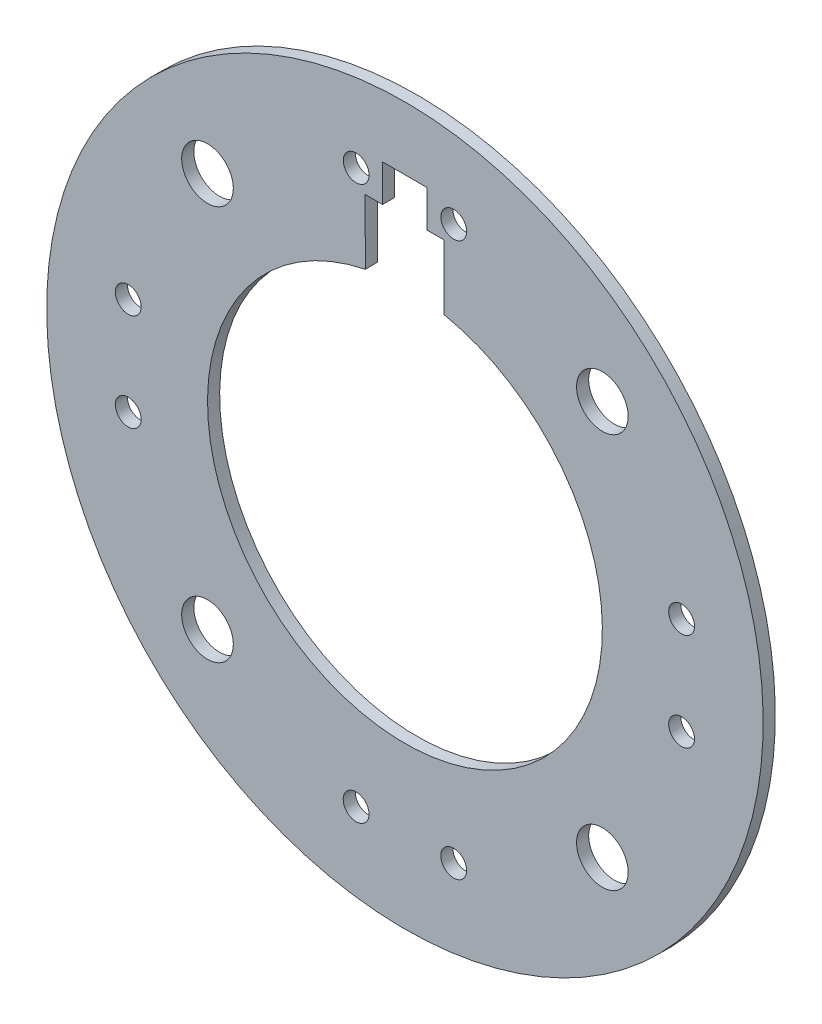
ISO-10303-21;
HEADER;
FILE_DESCRIPTION(('STEP AP214'),'2;1');
FILE_NAME('part.step','',(''),(''),'','','');
FILE_SCHEMA(('AUTOMOTIVE_DESIGN { 1 0 10303 214 1 1 1 1 }'));
ENDSEC;
DATA;
#1=APPLICATION_CONTEXT('core data for automotive mechanical design processes');
#2=APPLICATION_PROTOCOL_DEFINITION('international standard','automotive_design',2000,#1);
#3=PRODUCT_CONTEXT('',#1,'mechanical');
#4=PRODUCT('Part','Part','',(#3));
#5=PRODUCT_RELATED_PRODUCT_CATEGORY('part','',(#4));
#6=PRODUCT_DEFINITION_FORMATION('','',#4);
#7=PRODUCT_DEFINITION_CONTEXT('part definition',#1,'design');
#8=PRODUCT_DEFINITION('design','',#6,#7);
#9=PRODUCT_DEFINITION_SHAPE('','',#8);
#10=(LENGTH_UNIT() NAMED_UNIT(*) SI_UNIT(.MILLI.,.METRE.));
#11=(NAMED_UNIT(*) PLANE_ANGLE_UNIT() SI_UNIT($,.RADIAN.));
#12=(NAMED_UNIT(*) SI_UNIT($,.STERADIAN.) SOLID_ANGLE_UNIT());
#13=UNCERTAINTY_MEASURE_WITH_UNIT(LENGTH_MEASURE(1.E-05),#10,'distance_accuracy_value','');
#14=(GEOMETRIC_REPRESENTATION_CONTEXT(3) GLOBAL_UNCERTAINTY_ASSIGNED_CONTEXT((#13)) GLOBAL_UNIT_ASSIGNED_CONTEXT((#10,
#11,#12)) REPRESENTATION_CONTEXT('',''));
#15=CARTESIAN_POINT('',(0.,0.,0.));
#16=DIRECTION('',(0.,0.,1.));
#17=DIRECTION('',(1.,0.,0.));
#18=AXIS2_PLACEMENT_3D('',#15,#16,#17);
#19=CARTESIAN_POINT('',(-7.37144135781887,84.9999269356003,497.500013408569));
#20=DIRECTION('',(-1.,7.77181219380196E-09,0.));
#21=DIRECTION('',(0.,0.,1.));
#22=AXIS2_PLACEMENT_3D('',#19,#20,#21);
#23=PLANE('',#22);
#24=DIRECTION('',(7.77181219380196E-09,1.,0.));
#25=VECTOR('',#24,1.);
#26=CARTESIAN_POINT('',(-7.3714416881206,42.4999634964449,513.500013408569));
#27=LINE('',#26,#25);
#28=CARTESIAN_POINT('',(-7.3714413578679,84.9936173798591,513.500013408569));
#29=VERTEX_POINT('',#28);
#30=CARTESIAN_POINT('',(-7.37144126336427,97.1534100968481,513.500013408569));
#31=VERTEX_POINT('',#30);
#32=EDGE_CURVE('E639',#29,#31,#27,.T.);
#33=ORIENTED_EDGE('',*,*,#32,.T.);
#34=DIRECTION('',(0.,0.,-1.));
#35=VECTOR('',#34,1.);
#36=CARTESIAN_POINT('',(-7.37144126336427,97.1534100968481,501.500013408569));
#37=LINE('',#36,#35);
#38=CARTESIAN_POINT('',(-7.37144126336427,97.1534100968481,517.500013408569));
#39=VERTEX_POINT('',#38);
#40=EDGE_CURVE('E295',#39,#31,#37,.T.);
#41=ORIENTED_EDGE('',*,*,#40,.F.);
#42=DIRECTION('',(7.77181219380196E-09,1.,0.));
#43=VECTOR('',#42,1.);
#44=CARTESIAN_POINT('',(-7.37144129117325,93.575225187815,517.500013408569));
#45=LINE('',#44,#43);
#46=CARTESIAN_POINT('',(-7.37144135786791,84.9936173798591,517.500013408569));
#47=VERTEX_POINT('',#46);
#48=EDGE_CURVE('E347',#47,#39,#45,.T.);
#49=ORIENTED_EDGE('',*,*,#48,.F.);
#50=DIRECTION('',(0.,0.,-1.));
#51=VECTOR('',#50,1.);
#52=CARTESIAN_POINT('',(-7.3714413578679,84.9936173798591,485.500013170151));
#53=LINE('',#52,#51);
#54=EDGE_CURVE('E11',#47,#29,#53,.T.);
#55=ORIENTED_EDGE('',*,*,#54,.T.);
#56=EDGE_LOOP('',(#33,#41,#49,#55));
#57=FACE_BOUND('',#56,.T.);
#58=ADVANCED_FACE('F17',(#57),#23,.F.);
#59=CARTESIAN_POINT('',(12.9265078392562,85.0111661188135,465.500012931734));
#60=DIRECTION('',(-0.000864556917818171,0.999999626270598,0.));
#61=DIRECTION('',(0.,0.,1.));
#62=AXIS2_PLACEMENT_3D('',#59,#60,#61);
#63=PLANE('',#62);
#64=DIRECTION('',(0.999999626270598,0.000864556917818171,0.));
#65=VECTOR('',#64,1.);
#66=CARTESIAN_POINT('',(6.4265102684973,85.0055464988477,513.500013408569));
#67=LINE('',#66,#65);
#68=CARTESIAN_POINT('',(-13.0734824437794,84.9886876389502,513.500013408569));
#69=VERTEX_POINT('',#68);
#70=EDGE_CURVE('E236',#69,#29,#67,.T.);
#71=ORIENTED_EDGE('',*,*,#70,.T.);
#72=ORIENTED_EDGE('',*,*,#54,.F.);
#73=DIRECTION('',(0.999999626270598,0.000864556917818171,0.));
#74=VECTOR('',#73,1.);
#75=CARTESIAN_POINT('',(-23.0176264544443,84.980090357241,517.500013408569));
#76=LINE('',#75,#74);
#77=CARTESIAN_POINT('',(-13.0734824437794,84.9886876389502,517.500013408569));
#78=VERTEX_POINT('',#77);
#79=EDGE_CURVE('E232',#78,#47,#76,.T.);
#80=ORIENTED_EDGE('',*,*,#79,.F.);
#81=DIRECTION('',(0.,0.,1.));
#82=VECTOR('',#81,1.);
#83=CARTESIAN_POINT('',(-13.0734824437794,84.9886876389502,465.500012931734));
#84=LINE('',#83,#82);
#85=EDGE_CURVE('E20',#69,#78,#84,.T.);
#86=ORIENTED_EDGE('',*,*,#85,.F.);
#87=EDGE_LOOP('',(#71,#72,#80,#86));
#88=FACE_BOUND('',#87,.T.);
#89=ADVANCED_FACE('F590',(#88),#63,.F.);
#90=CARTESIAN_POINT('',(-13.0734824437794,84.9886876389502,465.500012931734));
#91=DIRECTION('',(-0.999999626270598,-0.000864556917818837,0.));
#92=DIRECTION('',(-0.000864556917818837,0.999999626270598,0.));
#93=AXIS2_PLACEMENT_3D('',#90,#91,#92);
#94=PLANE('',#93);
#95=DIRECTION('',(-0.000864556917818837,0.999999626270598,0.));
#96=VECTOR('',#95,1.);
#97=CARTESIAN_POINT('',(-13.0367387926486,42.4887241995093,513.500013408569));
#98=LINE('',#97,#96);
#99=CARTESIAN_POINT('',(-13.0550559473763,63.6754702708262,513.500013408569));
#100=VERTEX_POINT('',#99);
#101=EDGE_CURVE('E254',#100,#69,#98,.T.);
#102=ORIENTED_EDGE('',*,*,#101,.T.);
#103=ORIENTED_EDGE('',*,*,#85,.T.);
#104=DIRECTION('',(-0.000864556917818837,0.999999626270598,0.));
#105=VECTOR('',#104,1.);
#106=CARTESIAN_POINT('',(-13.0809182884659,93.5894422616638,517.500013408569));
#107=LINE('',#106,#105);
#108=CARTESIAN_POINT('',(-13.0550559473763,63.6754702708262,517.500013408569));
#109=VERTEX_POINT('',#108);
#110=EDGE_CURVE('E346',#109,#78,#107,.T.);
#111=ORIENTED_EDGE('',*,*,#110,.F.);
#112=DIRECTION('',(0.,0.,1.));
#113=VECTOR('',#112,1.);
#114=CARTESIAN_POINT('',(-13.0550559473763,63.6754702708262,493.00001328936));
#115=LINE('',#114,#113);
#116=EDGE_CURVE('E47',#100,#109,#115,.T.);
#117=ORIENTED_EDGE('',*,*,#116,.F.);
#118=EDGE_LOOP('',(#102,#103,#111,#117));
#119=FACE_BOUND('',#118,.T.);
#120=ADVANCED_FACE('F582',(#119),#94,.F.);
#121=CARTESIAN_POINT('',(0.,0.,489.00001328936));
#122=DIRECTION('',(0.,0.,-1.));
#123=DIRECTION('',(0.000864556917818641,-0.999999626270598,0.));
#124=AXIS2_PLACEMENT_3D('',#121,#122,#123);
#125=CYLINDRICAL_SURFACE('',#124,65.);
#126=CARTESIAN_POINT('',(0.,0.,513.500013408569));
#127=DIRECTION('',(0.,0.,-1.));
#128=DIRECTION('',(-0.5,0.866025403784439,0.));
#129=AXIS2_PLACEMENT_3D('',#126,#127,#128);
#130=CIRCLE('',#129,65.);
#131=CARTESIAN_POINT('',(12.9449343356593,63.6979487506895,513.500013408569));
#132=VERTEX_POINT('',#131);
#133=EDGE_CURVE('E703',#132,#100,#130,.T.);
#134=ORIENTED_EDGE('',*,*,#133,.T.);
#135=ORIENTED_EDGE('',*,*,#116,.T.);
#136=CARTESIAN_POINT('',(0.,0.,517.500013408569));
#137=DIRECTION('',(0.,0.,-1.));
#138=DIRECTION('',(0.5,-0.866025403784439,0.));
#139=AXIS2_PLACEMENT_3D('',#136,#137,#138);
#140=CIRCLE('',#139,65.);
#141=CARTESIAN_POINT('',(12.9449343356593,63.6979487506895,517.500013408569));
#142=VERTEX_POINT('',#141);
#143=EDGE_CURVE('E342',#142,#109,#140,.T.);
#144=ORIENTED_EDGE('',*,*,#143,.F.);
#145=DIRECTION('',(0.,0.,-1.));
#146=VECTOR('',#145,1.);
#147=CARTESIAN_POINT('',(12.9449343356593,63.6979487506895,493.00001328936));
#148=LINE('',#147,#146);
#149=EDGE_CURVE('E304',#142,#132,#148,.T.);
#150=ORIENTED_EDGE('',*,*,#149,.T.);
#151=EDGE_LOOP('',(#134,#135,#144,#150));
#152=FACE_BOUND('',#151,.T.);
#153=ADVANCED_FACE('F573',(#152),#125,.F.);
#154=CARTESIAN_POINT('',(-65.0006505257643,-65.0023113096677,467.499925954795));
#155=DIRECTION('',(-3.29805491736336E-11,0.,1.));
#156=DIRECTION('',(-1.,0.,-3.29805491736336E-11));
#157=AXIS2_PLACEMENT_3D('',#154,#155,#156);
#158=CYLINDRICAL_SURFACE('',#157,8.5);
#159=CARTESIAN_POINT('',(-65.0006505272814,-65.0023113096678,513.500013406425));
#160=DIRECTION('',(3.29805491736336E-11,0.,-1.));
#161=DIRECTION('',(-1.,0.,-3.29805491736336E-11));
#162=AXIS2_PLACEMENT_3D('',#159,#160,#161);
#163=CIRCLE('',#162,8.5);
#164=CARTESIAN_POINT('',(-56.5006505272814,-65.0023113096678,513.500013406706));
#165=VERTEX_POINT('',#164);
#166=EDGE_CURVE('E249',#165,#165,#163,.T.);
#167=ORIENTED_EDGE('',*,*,#166,.T.);
#168=DIRECTION('',(-3.29805491736336E-11,0.,1.));
#169=VECTOR('',#168,1.);
#170=CARTESIAN_POINT('',(-56.5006505257643,-65.0023113096677,467.499925955075));
#171=LINE('',#170,#169);
#172=CARTESIAN_POINT('',(-56.5006505274134,-65.0023113096678,517.50001340865));
#173=VERTEX_POINT('',#172);
#174=EDGE_CURVE('E380',#165,#173,#171,.T.);
#175=ORIENTED_EDGE('',*,*,#174,.T.);
#176=CARTESIAN_POINT('',(-65.0006505274134,-65.0023113096678,517.50001340837));
#177=DIRECTION('',(3.29805491736336E-11,0.,-1.));
#178=DIRECTION('',(-1.,0.,-3.29805491736336E-11));
#179=AXIS2_PLACEMENT_3D('',#176,#177,#178);
#180=CIRCLE('',#179,8.5);
#181=EDGE_CURVE('E275',#173,#173,#180,.T.);
#182=ORIENTED_EDGE('',*,*,#181,.F.);
#183=ORIENTED_EDGE('',*,*,#174,.F.);
#184=EDGE_LOOP('',(#167,#175,#182,#183));
#185=FACE_BOUND('',#184,.T.);
#186=ADVANCED_FACE('F564',(#185),#158,.F.);
#187=CARTESIAN_POINT('',(65.0006479123251,65.0025555502862,467.499925959083));
#188=DIRECTION('',(-3.29805565751205E-11,0.,1.));
#189=DIRECTION('',(-1.,0.,-3.29805565751205E-11));
#190=AXIS2_PLACEMENT_3D('',#187,#188,#189);
#191=CYLINDRICAL_SURFACE('',#190,8.5);
#192=CARTESIAN_POINT('',(65.0006479108079,65.002555550286,513.500013410713));
#193=DIRECTION('',(3.29805565751205E-11,0.,-1.));
#194=DIRECTION('',(-1.,0.,-3.29805565751205E-11));
#195=AXIS2_PLACEMENT_3D('',#192,#193,#194);
#196=CIRCLE('',#195,8.5);
#197=CARTESIAN_POINT('',(73.5006479108079,65.002555550286,513.500013410993));
#198=VERTEX_POINT('',#197);
#199=EDGE_CURVE('E253',#198,#198,#196,.T.);
#200=ORIENTED_EDGE('',*,*,#199,.T.);
#201=DIRECTION('',(-3.29805565751205E-11,0.,1.));
#202=VECTOR('',#201,1.);
#203=CARTESIAN_POINT('',(73.500647912325,65.0025555502862,467.499925959363));
#204=LINE('',#203,#202);
#205=CARTESIAN_POINT('',(73.500647910676,65.002555550286,517.500013412938));
#206=VERTEX_POINT('',#205);
#207=EDGE_CURVE('E379',#198,#206,#204,.T.);
#208=ORIENTED_EDGE('',*,*,#207,.T.);
#209=CARTESIAN_POINT('',(65.000647910676,65.002555550286,517.500013412658));
#210=DIRECTION('',(3.29805565751205E-11,0.,-1.));
#211=DIRECTION('',(-1.,0.,-3.29805565751205E-11));
#212=AXIS2_PLACEMENT_3D('',#209,#210,#211);
#213=CIRCLE('',#212,8.5);
#214=EDGE_CURVE('E271',#206,#206,#213,.T.);
#215=ORIENTED_EDGE('',*,*,#214,.F.);
#216=ORIENTED_EDGE('',*,*,#207,.F.);
#217=EDGE_LOOP('',(#200,#208,#215,#216));
#218=FACE_BOUND('',#217,.T.);
#219=ADVANCED_FACE('F429',(#218),#191,.F.);
#220=CARTESIAN_POINT('',(65.0024321232573,-65.0005270987355,467.499925959082));
#221=DIRECTION('',(-3.2980578779581E-11,0.,1.));
#222=DIRECTION('',(-1.,0.,-3.2980578779581E-11));
#223=AXIS2_PLACEMENT_3D('',#220,#221,#222);
#224=CYLINDRICAL_SURFACE('',#223,8.5);
#225=CARTESIAN_POINT('',(65.0024321217402,-65.0005270987356,513.500013410713));
#226=DIRECTION('',(3.2980578779581E-11,0.,-1.));
#227=DIRECTION('',(-1.,0.,-3.2980578779581E-11));
#228=AXIS2_PLACEMENT_3D('',#225,#226,#227);
#229=CIRCLE('',#228,8.5);
#230=CARTESIAN_POINT('',(73.5024321217402,-65.0005270987356,513.500013410993));
#231=VERTEX_POINT('',#230);
#232=EDGE_CURVE('E242',#231,#231,#229,.T.);
#233=ORIENTED_EDGE('',*,*,#232,.T.);
#234=DIRECTION('',(-3.2980578779581E-11,0.,1.));
#235=VECTOR('',#234,1.);
#236=CARTESIAN_POINT('',(73.5024321232573,-65.0005270987355,467.499925959363));
#237=LINE('',#236,#235);
#238=CARTESIAN_POINT('',(73.5024321216083,-65.0005270987356,517.500013412938));
#239=VERTEX_POINT('',#238);
#240=EDGE_CURVE('E371',#231,#239,#237,.T.);
#241=ORIENTED_EDGE('',*,*,#240,.T.);
#242=CARTESIAN_POINT('',(65.0024321216083,-65.0005270987356,517.500013412658));
#243=DIRECTION('',(3.2980578779581E-11,0.,-1.));
#244=DIRECTION('',(-1.,0.,-3.2980578779581E-11));
#245=AXIS2_PLACEMENT_3D('',#242,#243,#244);
#246=CIRCLE('',#245,8.5);
#247=EDGE_CURVE('E276',#239,#239,#246,.T.);
#248=ORIENTED_EDGE('',*,*,#247,.F.);
#249=ORIENTED_EDGE('',*,*,#240,.F.);
#250=EDGE_LOOP('',(#233,#241,#248,#249));
#251=FACE_BOUND('',#250,.T.);
#252=ADVANCED_FACE('F423',(#251),#224,.F.);
#253=CARTESIAN_POINT('',(-65.0024347366966,65.0007713393539,467.499925954795));
#254=DIRECTION('',(-3.2980578779581E-11,0.,1.));
#255=DIRECTION('',(-1.,0.,-3.2980578779581E-11));
#256=AXIS2_PLACEMENT_3D('',#253,#254,#255);
#257=CYLINDRICAL_SURFACE('',#256,8.5);
#258=CARTESIAN_POINT('',(-65.0024347382137,65.0007713393538,513.500013406426));
#259=DIRECTION('',(3.2980578779581E-11,0.,-1.));
#260=DIRECTION('',(-1.,0.,-3.2980578779581E-11));
#261=AXIS2_PLACEMENT_3D('',#258,#259,#260);
#262=CIRCLE('',#261,8.5);
#263=CARTESIAN_POINT('',(-56.5024347382137,65.0007713393538,513.500013406706));
#264=VERTEX_POINT('',#263);
#265=EDGE_CURVE('E238',#264,#264,#262,.T.);
#266=ORIENTED_EDGE('',*,*,#265,.T.);
#267=DIRECTION('',(-3.2980578779581E-11,0.,1.));
#268=VECTOR('',#267,1.);
#269=CARTESIAN_POINT('',(-56.5024347366966,65.0007713393539,467.499925955075));
#270=LINE('',#269,#268);
#271=CARTESIAN_POINT('',(-56.5024347383456,65.0007713393537,517.500013408651));
#272=VERTEX_POINT('',#271);
#273=EDGE_CURVE('E368',#264,#272,#270,.T.);
#274=ORIENTED_EDGE('',*,*,#273,.T.);
#275=CARTESIAN_POINT('',(-65.0024347383456,65.0007713393537,517.50001340837));
#276=DIRECTION('',(3.2980578779581E-11,0.,-1.));
#277=DIRECTION('',(-1.,0.,-3.2980578779581E-11));
#278=AXIS2_PLACEMENT_3D('',#275,#276,#277);
#279=CIRCLE('',#278,8.5);
#280=EDGE_CURVE('E338',#272,#272,#279,.T.);
#281=ORIENTED_EDGE('',*,*,#280,.F.);
#282=ORIENTED_EDGE('',*,*,#273,.F.);
#283=EDGE_LOOP('',(#266,#274,#281,#282));
#284=FACE_BOUND('',#283,.T.);
#285=ADVANCED_FACE('F428',(#284),#257,.F.);
#286=CARTESIAN_POINT('',(-16.0565921697459,91.0960797410618,485.500012931733));
#287=DIRECTION('',(0.,0.,1.));
#288=DIRECTION('',(-1.,7.77181227870136E-09,0.));
#289=AXIS2_PLACEMENT_3D('',#286,#287,#288);
#290=CYLINDRICAL_SURFACE('',#289,4.25);
#291=CARTESIAN_POINT('',(-16.0565921697459,91.0960797410618,513.500013408569));
#292=DIRECTION('',(0.,0.,-1.));
#293=DIRECTION('',(-1.,7.77181227870136E-09,0.));
#294=AXIS2_PLACEMENT_3D('',#291,#292,#293);
#295=CIRCLE('',#294,4.25);
#296=CARTESIAN_POINT('',(-11.8065921697459,91.0960797080317,513.500013408569));
#297=VERTEX_POINT('',#296);
#298=EDGE_CURVE('E241',#297,#297,#295,.T.);
#299=ORIENTED_EDGE('',*,*,#298,.T.);
#300=DIRECTION('',(0.,0.,1.));
#301=VECTOR('',#300,1.);
#302=CARTESIAN_POINT('',(-11.8065921697459,91.0960797080317,485.500012931733));
#303=LINE('',#302,#301);
#304=CARTESIAN_POINT('',(-11.8065921697459,91.0960797080316,517.500013408569));
#305=VERTEX_POINT('',#304);
#306=EDGE_CURVE('E372',#297,#305,#303,.T.);
#307=ORIENTED_EDGE('',*,*,#306,.T.);
#308=CARTESIAN_POINT('',(-16.0565921697459,91.0960797410618,517.500013408569));
#309=DIRECTION('',(0.,0.,-1.));
#310=DIRECTION('',(-1.,7.77181227870136E-09,0.));
#311=AXIS2_PLACEMENT_3D('',#308,#309,#310);
#312=CIRCLE('',#311,4.25);
#313=EDGE_CURVE('E334',#305,#305,#312,.T.);
#314=ORIENTED_EDGE('',*,*,#313,.F.);
#315=ORIENTED_EDGE('',*,*,#306,.F.);
#316=EDGE_LOOP('',(#299,#307,#314,#315));
#317=FACE_BOUND('',#316,.T.);
#318=ADVANCED_FACE('F480',(#317),#290,.F.);
#319=CARTESIAN_POINT('',(16.0683206970404,91.0957595379094,485.500012931733));
#320=DIRECTION('',(0.,0.,1.));
#321=DIRECTION('',(-1.,7.77181227870137E-09,0.));
#322=AXIS2_PLACEMENT_3D('',#319,#320,#321);
#323=CYLINDRICAL_SURFACE('',#322,4.25);
#324=CARTESIAN_POINT('',(16.0683206970404,91.0957595379094,513.500013408569));
#325=DIRECTION('',(0.,0.,-1.));
#326=DIRECTION('',(-1.,7.77181227870137E-09,0.));
#327=AXIS2_PLACEMENT_3D('',#324,#325,#326);
#328=CIRCLE('',#327,4.25);
#329=CARTESIAN_POINT('',(20.3183206970404,91.0957595048792,513.500013408569));
#330=VERTEX_POINT('',#329);
#331=EDGE_CURVE('E260',#330,#330,#328,.T.);
#332=ORIENTED_EDGE('',*,*,#331,.T.);
#333=DIRECTION('',(0.,0.,1.));
#334=VECTOR('',#333,1.);
#335=CARTESIAN_POINT('',(20.3183206970404,91.0957595048792,485.500012931733));
#336=LINE('',#335,#334);
#337=CARTESIAN_POINT('',(20.3183206970404,91.0957595048792,517.500013408569));
#338=VERTEX_POINT('',#337);
#339=EDGE_CURVE('E366',#330,#338,#336,.T.);
#340=ORIENTED_EDGE('',*,*,#339,.T.);
#341=CARTESIAN_POINT('',(16.0683206970404,91.0957595379094,517.500013408569));
#342=DIRECTION('',(0.,0.,-1.));
#343=DIRECTION('',(-1.,7.77181227870137E-09,0.));
#344=AXIS2_PLACEMENT_3D('',#341,#342,#343);
#345=CIRCLE('',#344,4.25);
#346=EDGE_CURVE('E330',#338,#338,#345,.T.);
#347=ORIENTED_EDGE('',*,*,#346,.F.);
#348=ORIENTED_EDGE('',*,*,#339,.F.);
#349=EDGE_LOOP('',(#332,#340,#347,#348));
#350=FACE_BOUND('',#349,.T.);
#351=ADVANCED_FACE('F474',(#350),#323,.F.);
#352=CARTESIAN_POINT('',(91.0960797410618,16.0565921697458,485.500012931733));
#353=DIRECTION('',(0.,0.,1.));
#354=DIRECTION('',(7.77181221339413E-09,1.,0.));
#355=AXIS2_PLACEMENT_3D('',#352,#353,#354);
#356=CYLINDRICAL_SURFACE('',#355,4.25);
#357=CARTESIAN_POINT('',(91.0960797410618,16.0565921697458,513.500013408569));
#358=DIRECTION('',(0.,0.,-1.));
#359=DIRECTION('',(7.77181221339413E-09,1.,0.));
#360=AXIS2_PLACEMENT_3D('',#357,#358,#359);
#361=CIRCLE('',#360,4.25);
#362=CARTESIAN_POINT('',(91.0960797080316,11.8065921697458,513.500013408569));
#363=VERTEX_POINT('',#362);
#364=EDGE_CURVE('E255',#363,#363,#361,.T.);
#365=ORIENTED_EDGE('',*,*,#364,.T.);
#366=DIRECTION('',(0.,0.,1.));
#367=VECTOR('',#366,1.);
#368=CARTESIAN_POINT('',(91.0960797080316,11.8065921697458,485.500012931733));
#369=LINE('',#368,#367);
#370=CARTESIAN_POINT('',(91.0960797080316,11.8065921697458,517.500013408569));
#371=VERTEX_POINT('',#370);
#372=EDGE_CURVE('E364',#363,#371,#369,.T.);
#373=ORIENTED_EDGE('',*,*,#372,.T.);
#374=CARTESIAN_POINT('',(91.0960797410618,16.0565921697458,517.500013408569));
#375=DIRECTION('',(0.,0.,-1.));
#376=DIRECTION('',(7.77181221339413E-09,1.,0.));
#377=AXIS2_PLACEMENT_3D('',#374,#375,#376);
#378=CIRCLE('',#377,4.25);
#379=EDGE_CURVE('E327',#371,#371,#378,.T.);
#380=ORIENTED_EDGE('',*,*,#379,.F.);
#381=ORIENTED_EDGE('',*,*,#372,.F.);
#382=EDGE_LOOP('',(#365,#373,#380,#381));
#383=FACE_BOUND('',#382,.T.);
#384=ADVANCED_FACE('F479',(#383),#356,.F.);
#385=CARTESIAN_POINT('',(91.0957595379093,-16.0683206970404,485.500012931733));
#386=DIRECTION('',(0.,0.,1.));
#387=DIRECTION('',(7.77181221339414E-09,1.,0.));
#388=AXIS2_PLACEMENT_3D('',#385,#386,#387);
#389=CYLINDRICAL_SURFACE('',#388,4.25);
#390=CARTESIAN_POINT('',(91.0957595379093,-16.0683206970404,513.500013408569));
#391=DIRECTION('',(0.,0.,-1.));
#392=DIRECTION('',(7.77181221339414E-09,1.,0.));
#393=AXIS2_PLACEMENT_3D('',#390,#391,#392);
#394=CIRCLE('',#393,4.25);
#395=CARTESIAN_POINT('',(91.0957595048791,-20.3183206970404,513.500013408569));
#396=VERTEX_POINT('',#395);
#397=EDGE_CURVE('E259',#396,#396,#394,.T.);
#398=ORIENTED_EDGE('',*,*,#397,.T.);
#399=DIRECTION('',(0.,0.,1.));
#400=VECTOR('',#399,1.);
#401=CARTESIAN_POINT('',(91.0957595048791,-20.3183206970404,485.500012931733));
#402=LINE('',#401,#400);
#403=CARTESIAN_POINT('',(91.0957595048791,-20.3183206970404,517.500013408569));
#404=VERTEX_POINT('',#403);
#405=EDGE_CURVE('E264',#396,#404,#402,.T.);
#406=ORIENTED_EDGE('',*,*,#405,.T.);
#407=CARTESIAN_POINT('',(91.0957595379093,-16.0683206970404,517.500013408569));
#408=DIRECTION('',(0.,0.,-1.));
#409=DIRECTION('',(7.77181221339414E-09,1.,0.));
#410=AXIS2_PLACEMENT_3D('',#407,#408,#409);
#411=CIRCLE('',#410,4.25);
#412=EDGE_CURVE('E322',#404,#404,#411,.T.);
#413=ORIENTED_EDGE('',*,*,#412,.F.);
#414=ORIENTED_EDGE('',*,*,#405,.F.);
#415=EDGE_LOOP('',(#398,#406,#413,#414));
#416=FACE_BOUND('',#415,.T.);
#417=ADVANCED_FACE('F468',(#416),#389,.F.);
#418=CARTESIAN_POINT('',(16.0565921697458,-91.0960797410618,485.500012931733));
#419=DIRECTION('',(0.,0.,1.));
#420=DIRECTION('',(1.,-7.77181214808689E-09,0.));
#421=AXIS2_PLACEMENT_3D('',#418,#419,#420);
#422=CYLINDRICAL_SURFACE('',#421,4.25);
#423=CARTESIAN_POINT('',(16.0565921697458,-91.0960797410618,513.500013408569));
#424=DIRECTION('',(0.,0.,-1.));
#425=DIRECTION('',(1.,-7.77181214808689E-09,0.));
#426=AXIS2_PLACEMENT_3D('',#423,#424,#425);
#427=CIRCLE('',#426,4.25);
#428=CARTESIAN_POINT('',(11.8065921697458,-91.0960797080316,513.500013408569));
#429=VERTEX_POINT('',#428);
#430=EDGE_CURVE('E266',#429,#429,#427,.T.);
#431=ORIENTED_EDGE('',*,*,#430,.T.);
#432=DIRECTION('',(0.,0.,1.));
#433=VECTOR('',#432,1.);
#434=CARTESIAN_POINT('',(11.8065921697458,-91.0960797080316,485.500012931733));
#435=LINE('',#434,#433);
#436=CARTESIAN_POINT('',(11.8065921697458,-91.0960797080316,517.500013408569));
#437=VERTEX_POINT('',#436);
#438=EDGE_CURVE('E261',#429,#437,#435,.T.);
#439=ORIENTED_EDGE('',*,*,#438,.T.);
#440=CARTESIAN_POINT('',(16.0565921697458,-91.0960797410618,517.500013408569));
#441=DIRECTION('',(0.,0.,-1.));
#442=DIRECTION('',(1.,-7.77181214808689E-09,0.));
#443=AXIS2_PLACEMENT_3D('',#440,#441,#442);
#444=CIRCLE('',#443,4.25);
#445=EDGE_CURVE('E318',#437,#437,#444,.T.);
#446=ORIENTED_EDGE('',*,*,#445,.F.);
#447=ORIENTED_EDGE('',*,*,#438,.F.);
#448=EDGE_LOOP('',(#431,#439,#446,#447));
#449=FACE_BOUND('',#448,.T.);
#450=ADVANCED_FACE('F463',(#449),#422,.F.);
#451=CARTESIAN_POINT('',(-16.0683206970404,-91.0957595379094,485.500012931733));
#452=DIRECTION('',(0.,0.,1.));
#453=DIRECTION('',(1.,-7.7718121480869E-09,0.));
#454=AXIS2_PLACEMENT_3D('',#451,#452,#453);
#455=CYLINDRICAL_SURFACE('',#454,4.25);
#456=CARTESIAN_POINT('',(-16.0683206970404,-91.0957595379094,513.500013408569));
#457=DIRECTION('',(0.,0.,-1.));
#458=DIRECTION('',(1.,-7.7718121480869E-09,0.));
#459=AXIS2_PLACEMENT_3D('',#456,#457,#458);
#460=CIRCLE('',#459,4.25);
#461=CARTESIAN_POINT('',(-20.3183206970404,-91.0957595048792,513.500013408569));
#462=VERTEX_POINT('',#461);
#463=EDGE_CURVE('E270',#462,#462,#460,.T.);
#464=ORIENTED_EDGE('',*,*,#463,.T.);
#465=DIRECTION('',(0.,0.,1.));
#466=VECTOR('',#465,1.);
#467=CARTESIAN_POINT('',(-20.3183206970404,-91.0957595048792,485.500012931733));
#468=LINE('',#467,#466);
#469=CARTESIAN_POINT('',(-20.3183206970404,-91.0957595048792,517.500013408569));
#470=VERTEX_POINT('',#469);
#471=EDGE_CURVE('E265',#462,#470,#468,.T.);
#472=ORIENTED_EDGE('',*,*,#471,.T.);
#473=CARTESIAN_POINT('',(-16.0683206970404,-91.0957595379094,517.500013408569));
#474=DIRECTION('',(0.,0.,-1.));
#475=DIRECTION('',(1.,-7.7718121480869E-09,0.));
#476=AXIS2_PLACEMENT_3D('',#473,#474,#475);
#477=CIRCLE('',#476,4.25);
#478=EDGE_CURVE('E323',#470,#470,#477,.T.);
#479=ORIENTED_EDGE('',*,*,#478,.F.);
#480=ORIENTED_EDGE('',*,*,#471,.F.);
#481=EDGE_LOOP('',(#464,#472,#479,#480));
#482=FACE_BOUND('',#481,.T.);
#483=ADVANCED_FACE('F416',(#482),#455,.F.);
#484=CARTESIAN_POINT('',(-91.0960797410618,-16.0565921697459,485.500012931733));
#485=DIRECTION('',(0.,0.,1.));
#486=DIRECTION('',(-7.77181208277965E-09,-1.,0.));
#487=AXIS2_PLACEMENT_3D('',#484,#485,#486);
#488=CYLINDRICAL_SURFACE('',#487,4.25);
#489=CARTESIAN_POINT('',(-91.0960797410618,-16.0565921697459,513.500013408569));
#490=DIRECTION('',(0.,0.,-1.));
#491=DIRECTION('',(-7.77181208277965E-09,-1.,0.));
#492=AXIS2_PLACEMENT_3D('',#489,#490,#491);
#493=CIRCLE('',#492,4.25);
#494=CARTESIAN_POINT('',(-91.0960797080317,-11.8065921697459,513.500013408569));
#495=VERTEX_POINT('',#494);
#496=EDGE_CURVE('E280',#495,#495,#493,.T.);
#497=ORIENTED_EDGE('',*,*,#496,.T.);
#498=DIRECTION('',(0.,0.,1.));
#499=VECTOR('',#498,1.);
#500=CARTESIAN_POINT('',(-91.0960797080317,-11.8065921697459,485.500012931733));
#501=LINE('',#500,#499);
#502=CARTESIAN_POINT('',(-91.0960797080317,-11.8065921697459,517.500013408569));
#503=VERTEX_POINT('',#502);
#504=EDGE_CURVE('E229',#495,#503,#501,.T.);
#505=ORIENTED_EDGE('',*,*,#504,.T.);
#506=CARTESIAN_POINT('',(-91.0960797410618,-16.0565921697459,517.500013408569));
#507=DIRECTION('',(0.,0.,-1.));
#508=DIRECTION('',(-7.77181208277965E-09,-1.,0.));
#509=AXIS2_PLACEMENT_3D('',#506,#507,#508);
#510=CIRCLE('',#509,4.25);
#511=EDGE_CURVE('E316',#503,#503,#510,.T.);
#512=ORIENTED_EDGE('',*,*,#511,.F.);
#513=ORIENTED_EDGE('',*,*,#504,.F.);
#514=EDGE_LOOP('',(#497,#505,#512,#513));
#515=FACE_BOUND('',#514,.T.);
#516=ADVANCED_FACE('F410',(#515),#488,.F.);
#517=CARTESIAN_POINT('',(-91.0957595379094,16.0683206970404,485.500012931733));
#518=DIRECTION('',(0.,0.,1.));
#519=DIRECTION('',(-7.77181208277966E-09,-1.,0.));
#520=AXIS2_PLACEMENT_3D('',#517,#518,#519);
#521=CYLINDRICAL_SURFACE('',#520,4.25);
#522=CARTESIAN_POINT('',(-91.0957595379094,16.0683206970404,513.500013408569));
#523=DIRECTION('',(0.,0.,-1.));
#524=DIRECTION('',(-7.77181208277966E-09,-1.,0.));
#525=AXIS2_PLACEMENT_3D('',#522,#523,#524);
#526=CIRCLE('',#525,4.25);
#527=CARTESIAN_POINT('',(-91.0957595048792,20.3183206970404,513.500013408569));
#528=VERTEX_POINT('',#527);
#529=EDGE_CURVE('E285',#528,#528,#526,.T.);
#530=ORIENTED_EDGE('',*,*,#529,.T.);
#531=DIRECTION('',(0.,0.,1.));
#532=VECTOR('',#531,1.);
#533=CARTESIAN_POINT('',(-91.0957595048792,20.3183206970404,485.500012931733));
#534=LINE('',#533,#532);
#535=CARTESIAN_POINT('',(-91.0957595048792,20.3183206970404,517.500013408569));
#536=VERTEX_POINT('',#535);
#537=EDGE_CURVE('E222',#528,#536,#534,.T.);
#538=ORIENTED_EDGE('',*,*,#537,.T.);
#539=CARTESIAN_POINT('',(-91.0957595379094,16.0683206970404,517.500013408569));
#540=DIRECTION('',(0.,0.,-1.));
#541=DIRECTION('',(-7.77181208277966E-09,-1.,0.));
#542=AXIS2_PLACEMENT_3D('',#539,#540,#541);
#543=CIRCLE('',#542,4.25);
#544=EDGE_CURVE('E312',#536,#536,#543,.T.);
#545=ORIENTED_EDGE('',*,*,#544,.F.);
#546=ORIENTED_EDGE('',*,*,#537,.F.);
#547=EDGE_LOOP('',(#530,#538,#545,#546));
#548=FACE_BOUND('',#547,.T.);
#549=ADVANCED_FACE('F415',(#548),#521,.F.);
#550=CARTESIAN_POINT('',(0.,0.,489.500031562715));
#551=DIRECTION('',(0.,0.,1.));
#552=DIRECTION('',(-1.,0.,0.));
#553=AXIS2_PLACEMENT_3D('',#550,#551,#552);
#554=CYLINDRICAL_SURFACE('',#553,110.);
#555=CARTESIAN_POINT('',(0.,0.,513.500013408569));
#556=DIRECTION('',(0.,0.,1.));
#557=DIRECTION('',(-1.,0.,0.));
#558=AXIS2_PLACEMENT_3D('',#555,#556,#557);
#559=CIRCLE('',#558,110.);
#560=CARTESIAN_POINT('',(110.,0.,513.500013408569));
#561=VERTEX_POINT('',#560);
#562=EDGE_CURVE('E218',#561,#561,#559,.T.);
#563=ORIENTED_EDGE('',*,*,#562,.T.);
#564=DIRECTION('',(0.,0.,1.));
#565=VECTOR('',#564,1.);
#566=CARTESIAN_POINT('',(110.,0.,489.500031562715));
#567=LINE('',#566,#565);
#568=CARTESIAN_POINT('',(110.,0.,513.500029491426));
#569=VERTEX_POINT('',#568);
#570=EDGE_CURVE('E215',#561,#569,#567,.T.);
#571=ORIENTED_EDGE('',*,*,#570,.T.);
#572=CARTESIAN_POINT('',(0.,0.,513.500029491426));
#573=DIRECTION('',(0.,0.,1.));
#574=DIRECTION('',(-1.,0.,0.));
#575=AXIS2_PLACEMENT_3D('',#572,#573,#574);
#576=CIRCLE('',#575,110.);
#577=EDGE_CURVE('E220',#569,#569,#576,.T.);
#578=ORIENTED_EDGE('',*,*,#577,.F.);
#579=ORIENTED_EDGE('',*,*,#570,.F.);
#580=EDGE_LOOP('',(#563,#571,#578,#579));
#581=FACE_BOUND('',#580,.T.);
#582=ADVANCED_FACE('F216',(#581),#554,.T.);
#583=CARTESIAN_POINT('',(0.,0.,515.000013408569));
#584=DIRECTION('',(0.,0.,-1.));
#585=DIRECTION('',(-0.5,0.866025403784439,0.));
#586=AXIS2_PLACEMENT_3D('',#583,#584,#585);
#587=CYLINDRICAL_SURFACE('',#586,117.953264875036);
#588=CARTESIAN_POINT('',(0.,0.,513.500029491426));
#589=DIRECTION('',(0.,0.,-1.));
#590=DIRECTION('',(-0.5,0.866025403784439,0.));
#591=AXIS2_PLACEMENT_3D('',#588,#589,#590);
#592=CIRCLE('',#591,117.953264875036);
#593=CARTESIAN_POINT('',(58.9766324375178,-102.150523841095,513.500029491426));
#594=VERTEX_POINT('',#593);
#595=EDGE_CURVE('E311',#594,#594,#592,.T.);
#596=ORIENTED_EDGE('',*,*,#595,.F.);
#597=DIRECTION('',(0.,0.,1.));
#598=VECTOR('',#597,1.);
#599=CARTESIAN_POINT('',(58.9766324375178,-102.150523841095,515.000013408569));
#600=LINE('',#599,#598);
#601=CARTESIAN_POINT('',(58.9766324375178,-102.150523841095,517.500013408569));
#602=VERTEX_POINT('',#601);
#603=EDGE_CURVE('E223',#594,#602,#600,.T.);
#604=ORIENTED_EDGE('',*,*,#603,.T.);
#605=CARTESIAN_POINT('',(0.,0.,517.500013408569));
#606=DIRECTION('',(0.,0.,-1.));
#607=DIRECTION('',(0.5,-0.866025403784439,0.));
#608=AXIS2_PLACEMENT_3D('',#605,#606,#607);
#609=CIRCLE('',#608,117.953264875036);
#610=EDGE_CURVE('E317',#602,#602,#609,.T.);
#611=ORIENTED_EDGE('',*,*,#610,.T.);
#612=ORIENTED_EDGE('',*,*,#603,.F.);
#613=EDGE_LOOP('',(#596,#604,#611,#612));
#614=FACE_BOUND('',#613,.T.);
#615=ADVANCED_FACE('F500',(#614),#587,.T.);
#616=CARTESIAN_POINT('',(-58.9766324375178,102.150523841095,517.500013408569));
#617=DIRECTION('',(0.,0.,1.));
#618=DIRECTION('',(1.,0.,0.));
#619=AXIS2_PLACEMENT_3D('',#616,#617,#618);
#620=PLANE('',#619);
#621=ORIENTED_EDGE('',*,*,#48,.T.);
#622=DIRECTION('',(1.,-7.77181219380196E-09,0.));
#623=VECTOR('',#622,1.);
#624=CARTESIAN_POINT('',(-33.1740368698593,97.1534102973811,517.500013408569));
#625=LINE('',#624,#623);
#626=CARTESIAN_POINT('',(7.22446684775023,97.1534099834115,517.500013408569));
#627=VERTEX_POINT('',#626);
#628=EDGE_CURVE('E284',#39,#627,#625,.T.);
#629=ORIENTED_EDGE('',*,*,#628,.T.);
#630=DIRECTION('',(-7.77181219380196E-09,-1.,0.));
#631=VECTOR('',#630,1.);
#632=CARTESIAN_POINT('',(7.22446686716855,99.6519666550022,517.500013408569));
#633=LINE('',#632,#631);
#634=CARTESIAN_POINT('',(7.22446675334468,85.0062363779047,517.500013408569));
#635=VERTEX_POINT('',#634);
#636=EDGE_CURVE('E243',#627,#635,#633,.T.);
#637=ORIENTED_EDGE('',*,*,#636,.T.);
#638=DIRECTION('',(0.999999626270598,0.000864556917818171,0.));
#639=VECTOR('',#638,1.);
#640=CARTESIAN_POINT('',(-23.0176264544443,84.980090357241,517.500013408569));
#641=LINE('',#640,#639);
#642=CARTESIAN_POINT('',(12.9265078392562,85.0111661188135,517.500013408569));
#643=VERTEX_POINT('',#642);
#644=EDGE_CURVE('E303',#635,#643,#641,.T.);
#645=ORIENTED_EDGE('',*,*,#644,.T.);
#646=DIRECTION('',(0.000864556917818782,-0.999999626270598,0.));
#647=VECTOR('',#646,1.);
#648=CARTESIAN_POINT('',(12.9282852427712,82.9553120574651,517.500013408569));
#649=LINE('',#648,#647);
#650=EDGE_CURVE('E307',#643,#142,#649,.T.);
#651=ORIENTED_EDGE('',*,*,#650,.T.);
#652=ORIENTED_EDGE('',*,*,#143,.T.);
#653=ORIENTED_EDGE('',*,*,#110,.T.);
#654=ORIENTED_EDGE('',*,*,#79,.T.);
#655=EDGE_LOOP('',(#621,#629,#637,#645,#651,#652,#653,#654));
#656=FACE_BOUND('',#655,.T.);
#657=ORIENTED_EDGE('',*,*,#181,.T.);
#658=EDGE_LOOP('',(#657));
#659=FACE_BOUND('',#658,.T.);
#660=ORIENTED_EDGE('',*,*,#214,.T.);
#661=EDGE_LOOP('',(#660));
#662=FACE_BOUND('',#661,.T.);
#663=ORIENTED_EDGE('',*,*,#247,.T.);
#664=EDGE_LOOP('',(#663));
#665=FACE_BOUND('',#664,.T.);
#666=ORIENTED_EDGE('',*,*,#280,.T.);
#667=EDGE_LOOP('',(#666));
#668=FACE_BOUND('',#667,.T.);
#669=ORIENTED_EDGE('',*,*,#313,.T.);
#670=EDGE_LOOP('',(#669));
#671=FACE_BOUND('',#670,.T.);
#672=ORIENTED_EDGE('',*,*,#346,.T.);
#673=EDGE_LOOP('',(#672));
#674=FACE_BOUND('',#673,.T.);
#675=ORIENTED_EDGE('',*,*,#379,.T.);
#676=EDGE_LOOP('',(#675));
#677=FACE_BOUND('',#676,.T.);
#678=ORIENTED_EDGE('',*,*,#412,.T.);
#679=EDGE_LOOP('',(#678));
#680=FACE_BOUND('',#679,.T.);
#681=ORIENTED_EDGE('',*,*,#445,.T.);
#682=EDGE_LOOP('',(#681));
#683=FACE_BOUND('',#682,.T.);
#684=ORIENTED_EDGE('',*,*,#478,.T.);
#685=EDGE_LOOP('',(#684));
#686=FACE_BOUND('',#685,.T.);
#687=ORIENTED_EDGE('',*,*,#511,.T.);
#688=EDGE_LOOP('',(#687));
#689=FACE_BOUND('',#688,.T.);
#690=ORIENTED_EDGE('',*,*,#544,.T.);
#691=EDGE_LOOP('',(#690));
#692=FACE_BOUND('',#691,.T.);
#693=ORIENTED_EDGE('',*,*,#610,.F.);
#694=EDGE_LOOP('',(#693));
#695=FACE_BOUND('',#694,.T.);
#696=ADVANCED_FACE('F490',(#656,#659,#662,#665,#668,#671,#674,#677,#680,#683,#686,#689,#692,
#695),#620,.T.);
#697=CARTESIAN_POINT('',(0.,0.,513.500029491426));
#698=DIRECTION('',(0.,0.,-1.));
#699=DIRECTION('',(0.,-1.,0.));
#700=AXIS2_PLACEMENT_3D('',#697,#698,#699);
#701=PLANE('',#700);
#702=ORIENTED_EDGE('',*,*,#577,.T.);
#703=EDGE_LOOP('',(#702));
#704=FACE_BOUND('',#703,.T.);
#705=ORIENTED_EDGE('',*,*,#595,.T.);
#706=EDGE_LOOP('',(#705));
#707=FACE_BOUND('',#706,.T.);
#708=ADVANCED_FACE('F457',(#704,#707),#701,.T.);
#709=CARTESIAN_POINT('',(12.9449343356593,63.6979487506895,465.500012931734));
#710=DIRECTION('',(0.999999626270598,0.000864556917818782,0.));
#711=DIRECTION('',(0.,0.,-1.));
#712=AXIS2_PLACEMENT_3D('',#709,#710,#711);
#713=PLANE('',#712);
#714=DIRECTION('',(0.000864556917818782,-0.999999626270598,0.));
#715=VECTOR('',#714,1.);
#716=CARTESIAN_POINT('',(12.9724647385885,31.8545939953106,513.500013408569));
#717=LINE('',#716,#715);
#718=CARTESIAN_POINT('',(12.9265078392562,85.0111661188135,513.500013408569));
#719=VERTEX_POINT('',#718);
#720=EDGE_CURVE('E686',#719,#132,#717,.T.);
#721=ORIENTED_EDGE('',*,*,#720,.T.);
#722=ORIENTED_EDGE('',*,*,#149,.F.);
#723=ORIENTED_EDGE('',*,*,#650,.F.);
#724=DIRECTION('',(0.,0.,1.));
#725=VECTOR('',#724,1.);
#726=CARTESIAN_POINT('',(12.9265078392562,85.0111661188135,485.500012931734));
#727=LINE('',#726,#725);
#728=EDGE_CURVE('E247',#719,#643,#727,.T.);
#729=ORIENTED_EDGE('',*,*,#728,.F.);
#730=EDGE_LOOP('',(#721,#722,#723,#729));
#731=FACE_BOUND('',#730,.T.);
#732=ADVANCED_FACE('F448',(#731),#713,.F.);
#733=CARTESIAN_POINT('',(12.9265078392562,85.0111661188135,465.500012931734));
#734=DIRECTION('',(-0.000864556917818171,0.999999626270598,0.));
#735=DIRECTION('',(0.,0.,1.));
#736=AXIS2_PLACEMENT_3D('',#733,#734,#735);
#737=PLANE('',#736);
#738=DIRECTION('',(0.999999626270598,0.000864556917818171,0.));
#739=VECTOR('',#738,1.);
#740=CARTESIAN_POINT('',(6.4265102684973,85.0055464988477,513.500013408569));
#741=LINE('',#740,#739);
#742=CARTESIAN_POINT('',(7.22446675334466,85.0062363779046,513.500013408569));
#743=VERTEX_POINT('',#742);
#744=EDGE_CURVE('E662',#743,#719,#741,.T.);
#745=ORIENTED_EDGE('',*,*,#744,.T.);
#746=ORIENTED_EDGE('',*,*,#728,.T.);
#747=ORIENTED_EDGE('',*,*,#644,.F.);
#748=DIRECTION('',(0.,0.,-1.));
#749=VECTOR('',#748,1.);
#750=CARTESIAN_POINT('',(7.22446675334466,85.0062363779046,485.500013170151));
#751=LINE('',#750,#749);
#752=EDGE_CURVE('E248',#635,#743,#751,.T.);
#753=ORIENTED_EDGE('',*,*,#752,.T.);
#754=EDGE_LOOP('',(#745,#746,#747,#753));
#755=FACE_BOUND('',#754,.T.);
#756=ADVANCED_FACE('F439',(#755),#737,.F.);
#757=CARTESIAN_POINT('',(7.22446684775022,97.1534099834115,497.500013408569));
#758=DIRECTION('',(1.,-7.77181219380196E-09,0.));
#759=DIRECTION('',(0.,0.,-1.));
#760=AXIS2_PLACEMENT_3D('',#757,#758,#759);
#761=PLANE('',#760);
#762=DIRECTION('',(-7.77181219380196E-09,-1.,0.));
#763=VECTOR('',#762,1.);
#764=CARTESIAN_POINT('',(7.22446647022119,48.5767049636321,513.500013408569));
#765=LINE('',#764,#763);
#766=CARTESIAN_POINT('',(7.22446684775023,97.1534099834115,513.500013408569));
#767=VERTEX_POINT('',#766);
#768=EDGE_CURVE('E654',#767,#743,#765,.T.);
#769=ORIENTED_EDGE('',*,*,#768,.T.);
#770=ORIENTED_EDGE('',*,*,#752,.F.);
#771=ORIENTED_EDGE('',*,*,#636,.F.);
#772=DIRECTION('',(0.,0.,-1.));
#773=VECTOR('',#772,1.);
#774=CARTESIAN_POINT('',(7.22446684775023,97.1534099834115,501.500013408569));
#775=LINE('',#774,#773);
#776=EDGE_CURVE('E281',#627,#767,#775,.T.);
#777=ORIENTED_EDGE('',*,*,#776,.T.);
#778=EDGE_LOOP('',(#769,#770,#771,#777));
#779=FACE_BOUND('',#778,.T.);
#780=ADVANCED_FACE('F404',(#779),#761,.F.);
#781=CARTESIAN_POINT('',(-7.37144126336427,97.1534100968481,497.500013408569));
#782=DIRECTION('',(7.77181219380196E-09,1.,0.));
#783=DIRECTION('',(0.,0.,-1.));
#784=AXIS2_PLACEMENT_3D('',#781,#782,#783);
#785=PLANE('',#784);
#786=DIRECTION('',(1.,-7.77181219380196E-09,0.));
#787=VECTOR('',#786,1.);
#788=CARTESIAN_POINT('',(-3.68572025415312,97.1534100682034,513.500013408569));
#789=LINE('',#788,#787);
#790=EDGE_CURVE('E647',#31,#767,#789,.T.);
#791=ORIENTED_EDGE('',*,*,#790,.T.);
#792=ORIENTED_EDGE('',*,*,#776,.F.);
#793=ORIENTED_EDGE('',*,*,#628,.F.);
#794=ORIENTED_EDGE('',*,*,#40,.T.);
#795=EDGE_LOOP('',(#791,#792,#793,#794));
#796=FACE_BOUND('',#795,.T.);
#797=ADVANCED_FACE('F394',(#796),#785,.F.);
#798=CARTESIAN_POINT('',(0.,0.,513.500013408569));
#799=DIRECTION('',(0.,0.,1.));
#800=DIRECTION('',(1.,0.,0.));
#801=AXIS2_PLACEMENT_3D('',#798,#799,#800);
#802=PLANE('',#801);
#803=ORIENTED_EDGE('',*,*,#529,.F.);
#804=EDGE_LOOP('',(#803));
#805=FACE_BOUND('',#804,.T.);
#806=ORIENTED_EDGE('',*,*,#496,.F.);
#807=EDGE_LOOP('',(#806));
#808=FACE_BOUND('',#807,.T.);
#809=ORIENTED_EDGE('',*,*,#463,.F.);
#810=EDGE_LOOP('',(#809));
#811=FACE_BOUND('',#810,.T.);
#812=ORIENTED_EDGE('',*,*,#430,.F.);
#813=EDGE_LOOP('',(#812));
#814=FACE_BOUND('',#813,.T.);
#815=ORIENTED_EDGE('',*,*,#397,.F.);
#816=EDGE_LOOP('',(#815));
#817=FACE_BOUND('',#816,.T.);
#818=ORIENTED_EDGE('',*,*,#364,.F.);
#819=EDGE_LOOP('',(#818));
#820=FACE_BOUND('',#819,.T.);
#821=ORIENTED_EDGE('',*,*,#331,.F.);
#822=EDGE_LOOP('',(#821));
#823=FACE_BOUND('',#822,.T.);
#824=ORIENTED_EDGE('',*,*,#298,.F.);
#825=EDGE_LOOP('',(#824));
#826=FACE_BOUND('',#825,.T.);
#827=ORIENTED_EDGE('',*,*,#265,.F.);
#828=EDGE_LOOP('',(#827));
#829=FACE_BOUND('',#828,.T.);
#830=ORIENTED_EDGE('',*,*,#232,.F.);
#831=EDGE_LOOP('',(#830));
#832=FACE_BOUND('',#831,.T.);
#833=ORIENTED_EDGE('',*,*,#199,.F.);
#834=EDGE_LOOP('',(#833));
#835=FACE_BOUND('',#834,.T.);
#836=ORIENTED_EDGE('',*,*,#166,.F.);
#837=EDGE_LOOP('',(#836));
#838=FACE_BOUND('',#837,.T.);
#839=ORIENTED_EDGE('',*,*,#133,.F.);
#840=ORIENTED_EDGE('',*,*,#720,.F.);
#841=ORIENTED_EDGE('',*,*,#744,.F.);
#842=ORIENTED_EDGE('',*,*,#768,.F.);
#843=ORIENTED_EDGE('',*,*,#790,.F.);
#844=ORIENTED_EDGE('',*,*,#32,.F.);
#845=ORIENTED_EDGE('',*,*,#70,.F.);
#846=ORIENTED_EDGE('',*,*,#101,.F.);
#847=EDGE_LOOP('',(#839,#840,#841,#842,#843,#844,#845,#846));
#848=FACE_BOUND('',#847,.T.);
#849=ORIENTED_EDGE('',*,*,#562,.F.);
#850=EDGE_LOOP('',(#849));
#851=FACE_BOUND('',#850,.T.);
#852=ADVANCED_FACE('F389',(#805,#808,#811,#814,#817,#820,#823,#826,#829,#832,#835,#838,#848,
#851),#802,.F.);
#853=CLOSED_SHELL('',(#58,#89,#120,#153,#186,#219,#252,#285,#318,#351,#384,#417,#450,#483,#516,
#549,#582,#615,#696,#708,#732,#756,#780,#797,#852));
#854=MANIFOLD_SOLID_BREP('B1',#853);
#855=ADVANCED_BREP_SHAPE_REPRESENTATION('',(#18,#854),#14);
#856=SHAPE_DEFINITION_REPRESENTATION(#9,#855);
ENDSEC;
END-ISO-10303-21;
